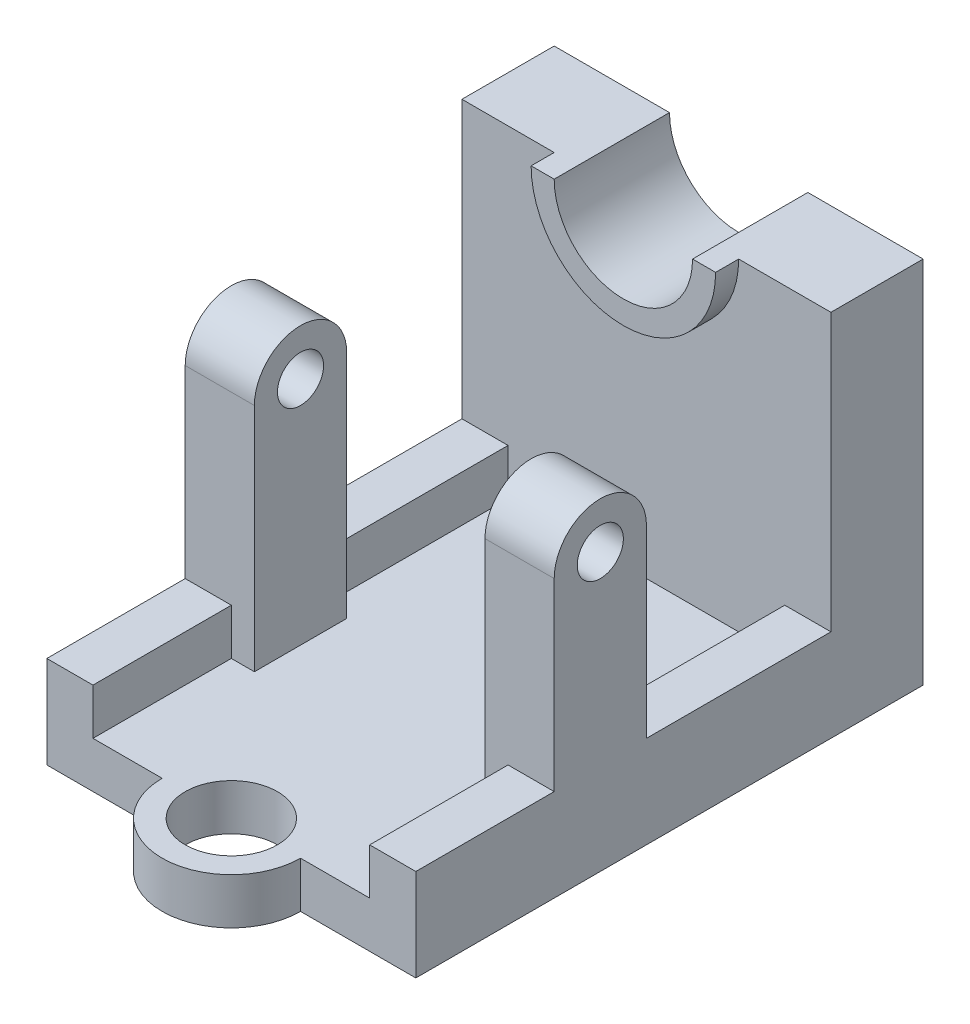
ISO-10303-21;
HEADER;
FILE_DESCRIPTION(('STEP AP214'),'2;1');
FILE_NAME('part.step','',(''),(''),'','','');
FILE_SCHEMA(('AUTOMOTIVE_DESIGN { 1 0 10303 214 1 1 1 1 }'));
ENDSEC;
DATA;
#1=APPLICATION_CONTEXT('core data for automotive mechanical design processes');
#2=APPLICATION_PROTOCOL_DEFINITION('international standard','automotive_design',2000,#1);
#3=PRODUCT_CONTEXT('',#1,'mechanical');
#4=PRODUCT('Part','Part','',(#3));
#5=PRODUCT_RELATED_PRODUCT_CATEGORY('part','',(#4));
#6=PRODUCT_DEFINITION_FORMATION('','',#4);
#7=PRODUCT_DEFINITION_CONTEXT('part definition',#1,'design');
#8=PRODUCT_DEFINITION('design','',#6,#7);
#9=PRODUCT_DEFINITION_SHAPE('','',#8);
#10=(LENGTH_UNIT() NAMED_UNIT(*) SI_UNIT(.MILLI.,.METRE.));
#11=(NAMED_UNIT(*) PLANE_ANGLE_UNIT() SI_UNIT($,.RADIAN.));
#12=(NAMED_UNIT(*) SI_UNIT($,.STERADIAN.) SOLID_ANGLE_UNIT());
#13=UNCERTAINTY_MEASURE_WITH_UNIT(LENGTH_MEASURE(1.E-05),#10,'distance_accuracy_value','');
#14=(GEOMETRIC_REPRESENTATION_CONTEXT(3) GLOBAL_UNCERTAINTY_ASSIGNED_CONTEXT((#13)) GLOBAL_UNIT_ASSIGNED_CONTEXT((#10,
#11,#12)) REPRESENTATION_CONTEXT('',''));
#15=CARTESIAN_POINT('',(0.,0.,0.));
#16=DIRECTION('',(0.,0.,1.));
#17=DIRECTION('',(1.,0.,0.));
#18=AXIS2_PLACEMENT_3D('',#15,#16,#17);
#19=CARTESIAN_POINT('',(-40.,20.,110.));
#20=DIRECTION('',(0.,-1.,0.));
#21=DIRECTION('',(0.,0.,-1.));
#22=AXIS2_PLACEMENT_3D('',#19,#20,#21);
#23=PLANE('',#22);
#24=DIRECTION('',(0.,0.,-1.));
#25=VECTOR('',#24,1.);
#26=CARTESIAN_POINT('',(-40.,20.,110.));
#27=LINE('',#26,#25);
#28=CARTESIAN_POINT('',(-40.,20.,60.));
#29=VERTEX_POINT('',#28);
#30=CARTESIAN_POINT('',(-40.,20.,20.));
#31=VERTEX_POINT('',#30);
#32=EDGE_CURVE('E500',#29,#31,#27,.T.);
#33=ORIENTED_EDGE('',*,*,#32,.F.);
#34=DIRECTION('',(1.,0.,0.));
#35=VECTOR('',#34,1.);
#36=CARTESIAN_POINT('',(-40.,20.,60.));
#37=LINE('',#36,#35);
#38=CARTESIAN_POINT('',(-30.,20.,60.));
#39=VERTEX_POINT('',#38);
#40=EDGE_CURVE('E287',#29,#39,#37,.T.);
#41=ORIENTED_EDGE('',*,*,#40,.T.);
#42=DIRECTION('',(0.,0.,-1.));
#43=VECTOR('',#42,1.);
#44=CARTESIAN_POINT('',(-30.,20.,110.));
#45=LINE('',#44,#43);
#46=CARTESIAN_POINT('',(-30.,20.,20.));
#47=VERTEX_POINT('',#46);
#48=EDGE_CURVE('E460',#39,#47,#45,.T.);
#49=ORIENTED_EDGE('',*,*,#48,.T.);
#50=DIRECTION('',(-1.,0.,0.));
#51=VECTOR('',#50,1.);
#52=CARTESIAN_POINT('',(-40.,20.,20.));
#53=LINE('',#52,#51);
#54=EDGE_CURVE('E427',#47,#31,#53,.T.);
#55=ORIENTED_EDGE('',*,*,#54,.T.);
#56=EDGE_LOOP('',(#33,#41,#49,#55));
#57=FACE_BOUND('',#56,.T.);
#58=ADVANCED_FACE('F45',(#57),#23,.F.);
#59=CARTESIAN_POINT('',(-30.,20.,110.));
#60=DIRECTION('',(-1.,0.,0.));
#61=DIRECTION('',(0.,-1.,0.));
#62=AXIS2_PLACEMENT_3D('',#59,#60,#61);
#63=PLANE('',#62);
#64=ORIENTED_EDGE('',*,*,#48,.F.);
#65=DIRECTION('',(0.,-1.,0.));
#66=VECTOR('',#65,1.);
#67=CARTESIAN_POINT('',(-30.,20.,60.));
#68=LINE('',#67,#66);
#69=CARTESIAN_POINT('',(-30.,10.,60.));
#70=VERTEX_POINT('',#69);
#71=EDGE_CURVE('E54',#39,#70,#68,.T.);
#72=ORIENTED_EDGE('',*,*,#71,.T.);
#73=DIRECTION('',(0.,0.,-1.));
#74=VECTOR('',#73,1.);
#75=CARTESIAN_POINT('',(-30.,10.,110.));
#76=LINE('',#75,#74);
#77=CARTESIAN_POINT('',(-30.,10.,20.));
#78=VERTEX_POINT('',#77);
#79=EDGE_CURVE('E475',#70,#78,#76,.T.);
#80=ORIENTED_EDGE('',*,*,#79,.T.);
#81=DIRECTION('',(0.,1.,0.));
#82=VECTOR('',#81,1.);
#83=CARTESIAN_POINT('',(-30.,20.,20.));
#84=LINE('',#83,#82);
#85=EDGE_CURVE('E503',#78,#47,#84,.T.);
#86=ORIENTED_EDGE('',*,*,#85,.T.);
#87=EDGE_LOOP('',(#64,#72,#80,#86));
#88=FACE_BOUND('',#87,.T.);
#89=ADVANCED_FACE('F530',(#88),#63,.F.);
#90=CARTESIAN_POINT('',(40.,20.,110.));
#91=DIRECTION('',(0.,-1.,0.));
#92=DIRECTION('',(0.,0.,-1.));
#93=AXIS2_PLACEMENT_3D('',#90,#91,#92);
#94=PLANE('',#93);
#95=DIRECTION('',(0.,0.,-1.));
#96=VECTOR('',#95,1.);
#97=CARTESIAN_POINT('',(30.,20.,110.));
#98=LINE('',#97,#96);
#99=CARTESIAN_POINT('',(30.,20.,60.));
#100=VERTEX_POINT('',#99);
#101=CARTESIAN_POINT('',(30.,20.,20.));
#102=VERTEX_POINT('',#101);
#103=EDGE_CURVE('E485',#100,#102,#98,.T.);
#104=ORIENTED_EDGE('',*,*,#103,.F.);
#105=DIRECTION('',(1.,0.,0.));
#106=VECTOR('',#105,1.);
#107=CARTESIAN_POINT('',(40.,20.,60.));
#108=LINE('',#107,#106);
#109=CARTESIAN_POINT('',(40.,20.,60.));
#110=VERTEX_POINT('',#109);
#111=EDGE_CURVE('E69',#100,#110,#108,.T.);
#112=ORIENTED_EDGE('',*,*,#111,.T.);
#113=DIRECTION('',(0.,0.,-1.));
#114=VECTOR('',#113,1.);
#115=CARTESIAN_POINT('',(40.,20.,110.));
#116=LINE('',#115,#114);
#117=CARTESIAN_POINT('',(40.,20.,20.));
#118=VERTEX_POINT('',#117);
#119=EDGE_CURVE('E490',#110,#118,#116,.T.);
#120=ORIENTED_EDGE('',*,*,#119,.T.);
#121=DIRECTION('',(-1.,0.,0.));
#122=VECTOR('',#121,1.);
#123=CARTESIAN_POINT('',(40.,20.,20.));
#124=LINE('',#123,#122);
#125=EDGE_CURVE('E423',#118,#102,#124,.T.);
#126=ORIENTED_EDGE('',*,*,#125,.T.);
#127=EDGE_LOOP('',(#104,#112,#120,#126));
#128=FACE_BOUND('',#127,.T.);
#129=ADVANCED_FACE('F630',(#128),#94,.F.);
#130=CARTESIAN_POINT('',(30.,20.,110.));
#131=DIRECTION('',(1.,0.,0.));
#132=DIRECTION('',(0.,1.,0.));
#133=AXIS2_PLACEMENT_3D('',#130,#131,#132);
#134=PLANE('',#133);
#135=DIRECTION('',(0.,0.,-1.));
#136=VECTOR('',#135,1.);
#137=CARTESIAN_POINT('',(30.,10.,110.));
#138=LINE('',#137,#136);
#139=CARTESIAN_POINT('',(30.,10.,60.));
#140=VERTEX_POINT('',#139);
#141=CARTESIAN_POINT('',(30.,10.,20.));
#142=VERTEX_POINT('',#141);
#143=EDGE_CURVE('E480',#140,#142,#138,.T.);
#144=ORIENTED_EDGE('',*,*,#143,.F.);
#145=DIRECTION('',(0.,1.,0.));
#146=VECTOR('',#145,1.);
#147=CARTESIAN_POINT('',(30.,20.,60.));
#148=LINE('',#147,#146);
#149=EDGE_CURVE('E334',#140,#100,#148,.T.);
#150=ORIENTED_EDGE('',*,*,#149,.T.);
#151=ORIENTED_EDGE('',*,*,#103,.T.);
#152=DIRECTION('',(0.,-1.,0.));
#153=VECTOR('',#152,1.);
#154=CARTESIAN_POINT('',(30.,20.,20.));
#155=LINE('',#154,#153);
#156=EDGE_CURVE('E419',#102,#142,#155,.T.);
#157=ORIENTED_EDGE('',*,*,#156,.T.);
#158=EDGE_LOOP('',(#144,#150,#151,#157));
#159=FACE_BOUND('',#158,.T.);
#160=ADVANCED_FACE('F629',(#159),#134,.F.);
#161=CARTESIAN_POINT('',(0.,0.,110.));
#162=DIRECTION('',(0.,0.,-1.));
#163=DIRECTION('',(-1.,0.,0.));
#164=AXIS2_PLACEMENT_3D('',#161,#162,#163);
#165=PLANE('',#164);
#166=DIRECTION('',(1.,0.,0.));
#167=VECTOR('',#166,1.);
#168=CARTESIAN_POINT('',(-40.,0.,110.));
#169=LINE('',#168,#167);
#170=CARTESIAN_POINT('',(-40.,0.,110.));
#171=VERTEX_POINT('',#170);
#172=CARTESIAN_POINT('',(-15.,0.,110.));
#173=VERTEX_POINT('',#172);
#174=EDGE_CURVE('E441',#171,#173,#169,.T.);
#175=ORIENTED_EDGE('',*,*,#174,.T.);
#176=DIRECTION('',(0.,1.,0.));
#177=VECTOR('',#176,1.);
#178=CARTESIAN_POINT('',(-15.,-33.5410196624969,110.));
#179=LINE('',#178,#177);
#180=CARTESIAN_POINT('',(-15.,10.,110.));
#181=VERTEX_POINT('',#180);
#182=EDGE_CURVE('E353',#173,#181,#179,.T.);
#183=ORIENTED_EDGE('',*,*,#182,.T.);
#184=DIRECTION('',(-1.,0.,0.));
#185=VECTOR('',#184,1.);
#186=CARTESIAN_POINT('',(-30.,10.,110.));
#187=LINE('',#186,#185);
#188=CARTESIAN_POINT('',(-30.,10.,110.));
#189=VERTEX_POINT('',#188);
#190=EDGE_CURVE('E453',#181,#189,#187,.T.);
#191=ORIENTED_EDGE('',*,*,#190,.T.);
#192=DIRECTION('',(0.,1.,0.));
#193=VECTOR('',#192,1.);
#194=CARTESIAN_POINT('',(-30.,20.,110.));
#195=LINE('',#194,#193);
#196=CARTESIAN_POINT('',(-30.,20.,110.));
#197=VERTEX_POINT('',#196);
#198=EDGE_CURVE('E457',#189,#197,#195,.T.);
#199=ORIENTED_EDGE('',*,*,#198,.T.);
#200=DIRECTION('',(-1.,0.,0.));
#201=VECTOR('',#200,1.);
#202=CARTESIAN_POINT('',(-40.,20.,110.));
#203=LINE('',#202,#201);
#204=CARTESIAN_POINT('',(-40.,20.,110.));
#205=VERTEX_POINT('',#204);
#206=EDGE_CURVE('E432',#197,#205,#203,.T.);
#207=ORIENTED_EDGE('',*,*,#206,.T.);
#208=DIRECTION('',(0.,-1.,0.));
#209=VECTOR('',#208,1.);
#210=CARTESIAN_POINT('',(-40.,20.,110.));
#211=LINE('',#210,#209);
#212=EDGE_CURVE('E436',#205,#171,#211,.T.);
#213=ORIENTED_EDGE('',*,*,#212,.T.);
#214=EDGE_LOOP('',(#175,#183,#191,#199,#207,#213));
#215=FACE_BOUND('',#214,.T.);
#216=ADVANCED_FACE('F637',(#215),#165,.F.);
#217=CARTESIAN_POINT('',(0.,0.,20.));
#218=DIRECTION('',(0.,0.,1.));
#219=DIRECTION('',(1.,0.,0.));
#220=AXIS2_PLACEMENT_3D('',#217,#218,#219);
#221=PLANE('',#220);
#222=DIRECTION('',(1.,0.,0.));
#223=VECTOR('',#222,1.);
#224=CARTESIAN_POINT('',(40.,80.,20.));
#225=LINE('',#224,#223);
#226=CARTESIAN_POINT('',(20.,80.,20.));
#227=VERTEX_POINT('',#226);
#228=CARTESIAN_POINT('',(40.,80.,20.));
#229=VERTEX_POINT('',#228);
#230=EDGE_CURVE('E399',#227,#229,#225,.T.);
#231=ORIENTED_EDGE('',*,*,#230,.F.);
#232=CARTESIAN_POINT('',(0.,80.,20.));
#233=DIRECTION('',(0.,0.,1.));
#234=DIRECTION('',(1.,0.,0.));
#235=AXIS2_PLACEMENT_3D('',#232,#233,#234);
#236=CIRCLE('',#235,20.);
#237=CARTESIAN_POINT('',(-20.,80.,20.));
#238=VERTEX_POINT('',#237);
#239=EDGE_CURVE('E352',#238,#227,#236,.T.);
#240=ORIENTED_EDGE('',*,*,#239,.F.);
#241=CARTESIAN_POINT('',(-40.,80.,20.));
#242=VERTEX_POINT('',#241);
#243=EDGE_CURVE('E400',#242,#238,#225,.T.);
#244=ORIENTED_EDGE('',*,*,#243,.F.);
#245=DIRECTION('',(0.,1.,0.));
#246=VECTOR('',#245,1.);
#247=CARTESIAN_POINT('',(-40.,0.,20.));
#248=LINE('',#247,#246);
#249=EDGE_CURVE('E395',#31,#242,#248,.T.);
#250=ORIENTED_EDGE('',*,*,#249,.F.);
#251=ORIENTED_EDGE('',*,*,#54,.F.);
#252=ORIENTED_EDGE('',*,*,#85,.F.);
#253=DIRECTION('',(-1.,0.,0.));
#254=VECTOR('',#253,1.);
#255=CARTESIAN_POINT('',(-30.,10.,20.));
#256=LINE('',#255,#254);
#257=EDGE_CURVE('E412',#142,#78,#256,.T.);
#258=ORIENTED_EDGE('',*,*,#257,.F.);
#259=ORIENTED_EDGE('',*,*,#156,.F.);
#260=ORIENTED_EDGE('',*,*,#125,.F.);
#261=DIRECTION('',(0.,-1.,0.));
#262=VECTOR('',#261,1.);
#263=CARTESIAN_POINT('',(40.,0.,20.));
#264=LINE('',#263,#262);
#265=EDGE_CURVE('E391',#229,#118,#264,.T.);
#266=ORIENTED_EDGE('',*,*,#265,.F.);
#267=EDGE_LOOP('',(#231,#240,#244,#250,#251,#252,#258,#259,#260,#266));
#268=FACE_BOUND('',#267,.T.);
#269=ADVANCED_FACE('F563',(#268),#221,.T.);
#270=CARTESIAN_POINT('',(40.,80.,20.));
#271=DIRECTION('',(0.,1.,0.));
#272=DIRECTION('',(0.,0.,1.));
#273=AXIS2_PLACEMENT_3D('',#270,#271,#272);
#274=PLANE('',#273);
#275=DIRECTION('',(0.,0.,1.));
#276=VECTOR('',#275,1.);
#277=CARTESIAN_POINT('',(-15.,80.,0.));
#278=LINE('',#277,#276);
#279=CARTESIAN_POINT('',(-15.,80.,0.));
#280=VERTEX_POINT('',#279);
#281=CARTESIAN_POINT('',(-15.,80.,25.));
#282=VERTEX_POINT('',#281);
#283=EDGE_CURVE('E510',#280,#282,#278,.T.);
#284=ORIENTED_EDGE('',*,*,#283,.F.);
#285=DIRECTION('',(1.,0.,0.));
#286=VECTOR('',#285,1.);
#287=CARTESIAN_POINT('',(40.,80.,0.));
#288=LINE('',#287,#286);
#289=CARTESIAN_POINT('',(-40.,80.,0.));
#290=VERTEX_POINT('',#289);
#291=EDGE_CURVE('E396',#290,#280,#288,.T.);
#292=ORIENTED_EDGE('',*,*,#291,.F.);
#293=DIRECTION('',(0.,0.,-1.));
#294=VECTOR('',#293,1.);
#295=CARTESIAN_POINT('',(-40.,80.,20.));
#296=LINE('',#295,#294);
#297=EDGE_CURVE('E404',#242,#290,#296,.T.);
#298=ORIENTED_EDGE('',*,*,#297,.F.);
#299=ORIENTED_EDGE('',*,*,#243,.T.);
#300=DIRECTION('',(0.,0.,-1.));
#301=VECTOR('',#300,1.);
#302=CARTESIAN_POINT('',(-20.,80.,25.));
#303=LINE('',#302,#301);
#304=CARTESIAN_POINT('',(-20.,80.,25.));
#305=VERTEX_POINT('',#304);
#306=EDGE_CURVE('E383',#305,#238,#303,.T.);
#307=ORIENTED_EDGE('',*,*,#306,.F.);
#308=DIRECTION('',(-1.,0.,0.));
#309=VECTOR('',#308,1.);
#310=CARTESIAN_POINT('',(-20.,80.,25.));
#311=LINE('',#310,#309);
#312=EDGE_CURVE('E367',#282,#305,#311,.T.);
#313=ORIENTED_EDGE('',*,*,#312,.F.);
#314=EDGE_LOOP('',(#284,#292,#298,#299,#307,#313));
#315=FACE_BOUND('',#314,.T.);
#316=ADVANCED_FACE('F610',(#315),#274,.T.);
#317=CARTESIAN_POINT('',(-30.,20.,80.));
#318=VERTEX_POINT('',#317);
#319=EDGE_CURVE('E471',#197,#318,#45,.T.);
#320=ORIENTED_EDGE('',*,*,#319,.T.);
#321=DIRECTION('',(-1.,0.,0.));
#322=VECTOR('',#321,1.);
#323=CARTESIAN_POINT('',(-40.,20.,80.));
#324=LINE('',#323,#322);
#325=CARTESIAN_POINT('',(-40.,20.,80.));
#326=VERTEX_POINT('',#325);
#327=EDGE_CURVE('E61',#318,#326,#324,.T.);
#328=ORIENTED_EDGE('',*,*,#327,.T.);
#329=EDGE_CURVE('E252',#205,#326,#27,.T.);
#330=ORIENTED_EDGE('',*,*,#329,.F.);
#331=ORIENTED_EDGE('',*,*,#206,.F.);
#332=EDGE_LOOP('',(#320,#328,#330,#331));
#333=FACE_BOUND('',#332,.T.);
#334=ADVANCED_FACE('F47',(#333),#23,.F.);
#335=CARTESIAN_POINT('',(-40.,20.,110.));
#336=DIRECTION('',(1.,0.,0.));
#337=DIRECTION('',(0.,0.,-1.));
#338=AXIS2_PLACEMENT_3D('',#335,#336,#337);
#339=PLANE('',#338);
#340=ORIENTED_EDGE('',*,*,#329,.T.);
#341=DIRECTION('',(0.,-1.,0.));
#342=VECTOR('',#341,1.);
#343=CARTESIAN_POINT('',(-40.,60.,80.));
#344=LINE('',#343,#342);
#345=CARTESIAN_POINT('',(-40.,60.,80.));
#346=VERTEX_POINT('',#345);
#347=EDGE_CURVE('E233',#346,#326,#344,.T.);
#348=ORIENTED_EDGE('',*,*,#347,.F.);
#349=CARTESIAN_POINT('',(-40.,60.,70.));
#350=DIRECTION('',(1.,0.,0.));
#351=DIRECTION('',(0.,0.,-1.));
#352=AXIS2_PLACEMENT_3D('',#349,#350,#351);
#353=CIRCLE('',#352,9.99999999999999);
#354=CARTESIAN_POINT('',(-40.,60.,60.));
#355=VERTEX_POINT('',#354);
#356=EDGE_CURVE('E250',#355,#346,#353,.T.);
#357=ORIENTED_EDGE('',*,*,#356,.F.);
#358=DIRECTION('',(0.,1.,0.));
#359=VECTOR('',#358,1.);
#360=CARTESIAN_POINT('',(-40.,0.,60.));
#361=LINE('',#360,#359);
#362=EDGE_CURVE('E242',#29,#355,#361,.T.);
#363=ORIENTED_EDGE('',*,*,#362,.F.);
#364=ORIENTED_EDGE('',*,*,#32,.T.);
#365=ORIENTED_EDGE('',*,*,#249,.T.);
#366=ORIENTED_EDGE('',*,*,#297,.T.);
#367=DIRECTION('',(0.,-1.,0.));
#368=VECTOR('',#367,1.);
#369=CARTESIAN_POINT('',(-40.,20.,0.));
#370=LINE('',#369,#368);
#371=CARTESIAN_POINT('',(-40.,0.,0.));
#372=VERTEX_POINT('',#371);
#373=EDGE_CURVE('E431',#290,#372,#370,.T.);
#374=ORIENTED_EDGE('',*,*,#373,.T.);
#375=DIRECTION('',(0.,0.,-1.));
#376=VECTOR('',#375,1.);
#377=CARTESIAN_POINT('',(-40.,0.,110.));
#378=LINE('',#377,#376);
#379=EDGE_CURVE('E497',#171,#372,#378,.T.);
#380=ORIENTED_EDGE('',*,*,#379,.F.);
#381=ORIENTED_EDGE('',*,*,#212,.F.);
#382=EDGE_LOOP('',(#340,#348,#357,#363,#364,#365,#366,#374,#380,#381));
#383=FACE_BOUND('',#382,.T.);
#384=CARTESIAN_POINT('',(-40.,60.,70.));
#385=DIRECTION('',(1.,0.,0.));
#386=DIRECTION('',(0.,0.,-1.));
#387=AXIS2_PLACEMENT_3D('',#384,#385,#386);
#388=CIRCLE('',#387,5.00000000000001);
#389=CARTESIAN_POINT('',(-40.,60.,65.));
#390=VERTEX_POINT('',#389);
#391=EDGE_CURVE('E272',#390,#390,#388,.T.);
#392=ORIENTED_EDGE('',*,*,#391,.T.);
#393=EDGE_LOOP('',(#392));
#394=FACE_BOUND('',#393,.T.);
#395=ADVANCED_FACE('F247',(#383,#394),#339,.F.);
#396=CARTESIAN_POINT('',(-40.,0.,110.));
#397=DIRECTION('',(0.,1.,0.));
#398=DIRECTION('',(0.,0.,1.));
#399=AXIS2_PLACEMENT_3D('',#396,#397,#398);
#400=PLANE('',#399);
#401=ORIENTED_EDGE('',*,*,#379,.T.);
#402=DIRECTION('',(1.,0.,0.));
#403=VECTOR('',#402,1.);
#404=CARTESIAN_POINT('',(-40.,0.,0.));
#405=LINE('',#404,#403);
#406=CARTESIAN_POINT('',(40.,0.,0.));
#407=VERTEX_POINT('',#406);
#408=EDGE_CURVE('E464',#372,#407,#405,.T.);
#409=ORIENTED_EDGE('',*,*,#408,.T.);
#410=DIRECTION('',(0.,0.,-1.));
#411=VECTOR('',#410,1.);
#412=CARTESIAN_POINT('',(40.,0.,110.));
#413=LINE('',#412,#411);
#414=CARTESIAN_POINT('',(40.,0.,110.));
#415=VERTEX_POINT('',#414);
#416=EDGE_CURVE('E494',#415,#407,#413,.T.);
#417=ORIENTED_EDGE('',*,*,#416,.F.);
#418=CARTESIAN_POINT('',(15.,0.,110.));
#419=VERTEX_POINT('',#418);
#420=EDGE_CURVE('E440',#419,#415,#169,.T.);
#421=ORIENTED_EDGE('',*,*,#420,.F.);
#422=CARTESIAN_POINT('',(0.,0.,110.));
#423=DIRECTION('',(0.,1.,0.));
#424=DIRECTION('',(0.,0.,1.));
#425=AXIS2_PLACEMENT_3D('',#422,#423,#424);
#426=CIRCLE('',#425,15.);
#427=EDGE_CURVE('E348',#419,#173,#426,.F.);
#428=ORIENTED_EDGE('',*,*,#427,.T.);
#429=ORIENTED_EDGE('',*,*,#174,.F.);
#430=EDGE_LOOP('',(#401,#409,#417,#421,#428,#429));
#431=FACE_BOUND('',#430,.T.);
#432=CARTESIAN_POINT('',(0.,0.,110.));
#433=DIRECTION('',(0.,1.,0.));
#434=DIRECTION('',(0.,0.,1.));
#435=AXIS2_PLACEMENT_3D('',#432,#433,#434);
#436=CIRCLE('',#435,10.);
#437=CARTESIAN_POINT('',(0.,0.,120.));
#438=VERTEX_POINT('',#437);
#439=EDGE_CURVE('E343',#438,#438,#436,.T.);
#440=ORIENTED_EDGE('',*,*,#439,.T.);
#441=EDGE_LOOP('',(#440));
#442=FACE_BOUND('',#441,.T.);
#443=ADVANCED_FACE('F601',(#431,#442),#400,.F.);
#444=CARTESIAN_POINT('',(40.,20.,110.));
#445=DIRECTION('',(-1.,0.,0.));
#446=DIRECTION('',(0.,0.,1.));
#447=AXIS2_PLACEMENT_3D('',#444,#445,#446);
#448=PLANE('',#447);
#449=ORIENTED_EDGE('',*,*,#416,.T.);
#450=DIRECTION('',(0.,1.,0.));
#451=VECTOR('',#450,1.);
#452=CARTESIAN_POINT('',(40.,20.,0.));
#453=LINE('',#452,#451);
#454=CARTESIAN_POINT('',(40.,80.,0.));
#455=VERTEX_POINT('',#454);
#456=EDGE_CURVE('E437',#407,#455,#453,.T.);
#457=ORIENTED_EDGE('',*,*,#456,.T.);
#458=DIRECTION('',(0.,0.,-1.));
#459=VECTOR('',#458,1.);
#460=CARTESIAN_POINT('',(40.,80.,20.));
#461=LINE('',#460,#459);
#462=EDGE_CURVE('E408',#229,#455,#461,.T.);
#463=ORIENTED_EDGE('',*,*,#462,.F.);
#464=ORIENTED_EDGE('',*,*,#265,.T.);
#465=ORIENTED_EDGE('',*,*,#119,.F.);
#466=DIRECTION('',(0.,1.,0.));
#467=VECTOR('',#466,1.);
#468=CARTESIAN_POINT('',(40.,0.,60.));
#469=LINE('',#468,#467);
#470=CARTESIAN_POINT('',(40.,60.,60.));
#471=VERTEX_POINT('',#470);
#472=EDGE_CURVE('E305',#110,#471,#469,.T.);
#473=ORIENTED_EDGE('',*,*,#472,.T.);
#474=CARTESIAN_POINT('',(40.,60.,70.));
#475=DIRECTION('',(1.,0.,0.));
#476=DIRECTION('',(0.,0.,-1.));
#477=AXIS2_PLACEMENT_3D('',#474,#475,#476);
#478=CIRCLE('',#477,9.99999999999999);
#479=CARTESIAN_POINT('',(40.,60.,80.));
#480=VERTEX_POINT('',#479);
#481=EDGE_CURVE('E296',#471,#480,#478,.T.);
#482=ORIENTED_EDGE('',*,*,#481,.T.);
#483=DIRECTION('',(0.,-1.,0.));
#484=VECTOR('',#483,1.);
#485=CARTESIAN_POINT('',(40.,60.,80.));
#486=LINE('',#485,#484);
#487=CARTESIAN_POINT('',(40.,20.,80.));
#488=VERTEX_POINT('',#487);
#489=EDGE_CURVE('E316',#480,#488,#486,.T.);
#490=ORIENTED_EDGE('',*,*,#489,.T.);
#491=CARTESIAN_POINT('',(40.,20.,110.));
#492=VERTEX_POINT('',#491);
#493=EDGE_CURVE('E491',#492,#488,#116,.T.);
#494=ORIENTED_EDGE('',*,*,#493,.F.);
#495=DIRECTION('',(0.,1.,0.));
#496=VECTOR('',#495,1.);
#497=CARTESIAN_POINT('',(40.,20.,110.));
#498=LINE('',#497,#496);
#499=EDGE_CURVE('E444',#415,#492,#498,.T.);
#500=ORIENTED_EDGE('',*,*,#499,.F.);
#501=EDGE_LOOP('',(#449,#457,#463,#464,#465,#473,#482,#490,#494,#500));
#502=FACE_BOUND('',#501,.T.);
#503=CARTESIAN_POINT('',(40.,60.,70.));
#504=DIRECTION('',(1.,0.,0.));
#505=DIRECTION('',(0.,0.,-1.));
#506=AXIS2_PLACEMENT_3D('',#503,#504,#505);
#507=CIRCLE('',#506,5.00000000000001);
#508=CARTESIAN_POINT('',(40.,60.,65.));
#509=VERTEX_POINT('',#508);
#510=EDGE_CURVE('E291',#509,#509,#507,.T.);
#511=ORIENTED_EDGE('',*,*,#510,.F.);
#512=EDGE_LOOP('',(#511));
#513=FACE_BOUND('',#512,.T.);
#514=ADVANCED_FACE('F552',(#502,#513),#448,.F.);
#515=ORIENTED_EDGE('',*,*,#493,.T.);
#516=DIRECTION('',(-1.,0.,0.));
#517=VECTOR('',#516,1.);
#518=CARTESIAN_POINT('',(40.,20.,80.));
#519=LINE('',#518,#517);
#520=CARTESIAN_POINT('',(30.,20.,80.));
#521=VERTEX_POINT('',#520);
#522=EDGE_CURVE('E331',#488,#521,#519,.T.);
#523=ORIENTED_EDGE('',*,*,#522,.T.);
#524=CARTESIAN_POINT('',(30.,20.,110.));
#525=VERTEX_POINT('',#524);
#526=EDGE_CURVE('E486',#525,#521,#98,.T.);
#527=ORIENTED_EDGE('',*,*,#526,.F.);
#528=DIRECTION('',(-1.,0.,0.));
#529=VECTOR('',#528,1.);
#530=CARTESIAN_POINT('',(40.,20.,110.));
#531=LINE('',#530,#529);
#532=EDGE_CURVE('E447',#492,#525,#531,.T.);
#533=ORIENTED_EDGE('',*,*,#532,.F.);
#534=EDGE_LOOP('',(#515,#523,#527,#533));
#535=FACE_BOUND('',#534,.T.);
#536=ADVANCED_FACE('F590',(#535),#94,.F.);
#537=ORIENTED_EDGE('',*,*,#526,.T.);
#538=DIRECTION('',(0.,-1.,0.));
#539=VECTOR('',#538,1.);
#540=CARTESIAN_POINT('',(30.,20.,80.));
#541=LINE('',#540,#539);
#542=CARTESIAN_POINT('',(30.,10.,80.));
#543=VERTEX_POINT('',#542);
#544=EDGE_CURVE('E326',#521,#543,#541,.T.);
#545=ORIENTED_EDGE('',*,*,#544,.T.);
#546=CARTESIAN_POINT('',(30.,10.,110.));
#547=VERTEX_POINT('',#546);
#548=EDGE_CURVE('E481',#547,#543,#138,.T.);
#549=ORIENTED_EDGE('',*,*,#548,.F.);
#550=DIRECTION('',(0.,-1.,0.));
#551=VECTOR('',#550,1.);
#552=CARTESIAN_POINT('',(30.,20.,110.));
#553=LINE('',#552,#551);
#554=EDGE_CURVE('E450',#525,#547,#553,.T.);
#555=ORIENTED_EDGE('',*,*,#554,.F.);
#556=EDGE_LOOP('',(#537,#545,#549,#555));
#557=FACE_BOUND('',#556,.T.);
#558=ADVANCED_FACE('F593',(#557),#134,.F.);
#559=CARTESIAN_POINT('',(-30.,10.,110.));
#560=DIRECTION('',(0.,-1.,0.));
#561=DIRECTION('',(0.,0.,-1.));
#562=AXIS2_PLACEMENT_3D('',#559,#560,#561);
#563=PLANE('',#562);
#564=ORIENTED_EDGE('',*,*,#79,.F.);
#565=DIRECTION('',(1.,0.,0.));
#566=VECTOR('',#565,1.);
#567=CARTESIAN_POINT('',(-30.,10.,60.));
#568=LINE('',#567,#566);
#569=CARTESIAN_POINT('',(-25.,10.,60.));
#570=VERTEX_POINT('',#569);
#571=EDGE_CURVE('E283',#70,#570,#568,.T.);
#572=ORIENTED_EDGE('',*,*,#571,.T.);
#573=DIRECTION('',(0.,0.,1.));
#574=VECTOR('',#573,1.);
#575=CARTESIAN_POINT('',(-25.,10.,110.));
#576=LINE('',#575,#574);
#577=CARTESIAN_POINT('',(-25.,10.,80.));
#578=VERTEX_POINT('',#577);
#579=EDGE_CURVE('E11',#570,#578,#576,.T.);
#580=ORIENTED_EDGE('',*,*,#579,.T.);
#581=DIRECTION('',(-1.,0.,0.));
#582=VECTOR('',#581,1.);
#583=CARTESIAN_POINT('',(-30.,10.,80.));
#584=LINE('',#583,#582);
#585=CARTESIAN_POINT('',(-30.,10.,80.));
#586=VERTEX_POINT('',#585);
#587=EDGE_CURVE('E276',#578,#586,#584,.T.);
#588=ORIENTED_EDGE('',*,*,#587,.T.);
#589=EDGE_CURVE('E476',#189,#586,#76,.T.);
#590=ORIENTED_EDGE('',*,*,#589,.F.);
#591=ORIENTED_EDGE('',*,*,#190,.F.);
#592=CARTESIAN_POINT('',(0.,10.,110.));
#593=DIRECTION('',(0.,1.,0.));
#594=DIRECTION('',(0.,0.,1.));
#595=AXIS2_PLACEMENT_3D('',#592,#593,#594);
#596=CIRCLE('',#595,15.);
#597=CARTESIAN_POINT('',(15.,10.,110.));
#598=VERTEX_POINT('',#597);
#599=EDGE_CURVE('E347',#181,#598,#596,.T.);
#600=ORIENTED_EDGE('',*,*,#599,.T.);
#601=EDGE_CURVE('E454',#547,#598,#187,.T.);
#602=ORIENTED_EDGE('',*,*,#601,.F.);
#603=ORIENTED_EDGE('',*,*,#548,.T.);
#604=DIRECTION('',(-1.,0.,0.));
#605=VECTOR('',#604,1.);
#606=CARTESIAN_POINT('',(-30.,10.,80.));
#607=LINE('',#606,#605);
#608=CARTESIAN_POINT('',(25.,10.,80.));
#609=VERTEX_POINT('',#608);
#610=EDGE_CURVE('E517',#543,#609,#607,.T.);
#611=ORIENTED_EDGE('',*,*,#610,.T.);
#612=DIRECTION('',(0.,0.,1.));
#613=VECTOR('',#612,1.);
#614=CARTESIAN_POINT('',(25.,10.,110.));
#615=LINE('',#614,#613);
#616=CARTESIAN_POINT('',(25.,10.,60.));
#617=VERTEX_POINT('',#616);
#618=EDGE_CURVE('E513',#617,#609,#615,.T.);
#619=ORIENTED_EDGE('',*,*,#618,.F.);
#620=DIRECTION('',(1.,0.,0.));
#621=VECTOR('',#620,1.);
#622=CARTESIAN_POINT('',(-30.,10.,60.));
#623=LINE('',#622,#621);
#624=EDGE_CURVE('E520',#617,#140,#623,.T.);
#625=ORIENTED_EDGE('',*,*,#624,.T.);
#626=ORIENTED_EDGE('',*,*,#143,.T.);
#627=ORIENTED_EDGE('',*,*,#257,.T.);
#628=EDGE_LOOP('',(#564,#572,#580,#588,#590,#591,#600,#602,#603,#611,#619,#625,#626,#627));
#629=FACE_BOUND('',#628,.T.);
#630=CARTESIAN_POINT('',(0.,10.,110.));
#631=DIRECTION('',(0.,1.,0.));
#632=DIRECTION('',(0.,0.,1.));
#633=AXIS2_PLACEMENT_3D('',#630,#631,#632);
#634=CIRCLE('',#633,10.);
#635=CARTESIAN_POINT('',(0.,10.,120.));
#636=VERTEX_POINT('',#635);
#637=EDGE_CURVE('E339',#636,#636,#634,.T.);
#638=ORIENTED_EDGE('',*,*,#637,.F.);
#639=EDGE_LOOP('',(#638));
#640=FACE_BOUND('',#639,.T.);
#641=ADVANCED_FACE('F533',(#629,#640),#563,.F.);
#642=ORIENTED_EDGE('',*,*,#589,.T.);
#643=DIRECTION('',(0.,1.,0.));
#644=VECTOR('',#643,1.);
#645=CARTESIAN_POINT('',(-30.,20.,80.));
#646=LINE('',#645,#644);
#647=EDGE_CURVE('E523',#586,#318,#646,.T.);
#648=ORIENTED_EDGE('',*,*,#647,.T.);
#649=ORIENTED_EDGE('',*,*,#319,.F.);
#650=ORIENTED_EDGE('',*,*,#198,.F.);
#651=EDGE_LOOP('',(#642,#648,#649,#650));
#652=FACE_BOUND('',#651,.T.);
#653=ADVANCED_FACE('F641',(#652),#63,.F.);
#654=ORIENTED_EDGE('',*,*,#601,.T.);
#655=DIRECTION('',(0.,1.,0.));
#656=VECTOR('',#655,1.);
#657=CARTESIAN_POINT('',(15.,-33.5410196624969,110.));
#658=LINE('',#657,#656);
#659=EDGE_CURVE('E357',#419,#598,#658,.T.);
#660=ORIENTED_EDGE('',*,*,#659,.F.);
#661=ORIENTED_EDGE('',*,*,#420,.T.);
#662=ORIENTED_EDGE('',*,*,#499,.T.);
#663=ORIENTED_EDGE('',*,*,#532,.T.);
#664=ORIENTED_EDGE('',*,*,#554,.T.);
#665=EDGE_LOOP('',(#654,#660,#661,#662,#663,#664));
#666=FACE_BOUND('',#665,.T.);
#667=ADVANCED_FACE('F597',(#666),#165,.F.);
#668=CARTESIAN_POINT('',(0.,0.,0.));
#669=DIRECTION('',(0.,0.,-1.));
#670=DIRECTION('',(-1.,0.,0.));
#671=AXIS2_PLACEMENT_3D('',#668,#669,#670);
#672=PLANE('',#671);
#673=CARTESIAN_POINT('',(0.,80.,0.));
#674=DIRECTION('',(0.,0.,1.));
#675=DIRECTION('',(1.,0.,0.));
#676=AXIS2_PLACEMENT_3D('',#673,#674,#675);
#677=CIRCLE('',#676,15.);
#678=CARTESIAN_POINT('',(15.,80.,0.));
#679=VERTEX_POINT('',#678);
#680=EDGE_CURVE('E386',#280,#679,#677,.T.);
#681=ORIENTED_EDGE('',*,*,#680,.T.);
#682=EDGE_CURVE('E390',#679,#455,#288,.T.);
#683=ORIENTED_EDGE('',*,*,#682,.T.);
#684=ORIENTED_EDGE('',*,*,#456,.F.);
#685=ORIENTED_EDGE('',*,*,#408,.F.);
#686=ORIENTED_EDGE('',*,*,#373,.F.);
#687=ORIENTED_EDGE('',*,*,#291,.T.);
#688=EDGE_LOOP('',(#681,#683,#684,#685,#686,#687));
#689=FACE_BOUND('',#688,.T.);
#690=ADVANCED_FACE('F547',(#689),#672,.T.);
#691=DIRECTION('',(0.,0.,1.));
#692=VECTOR('',#691,1.);
#693=CARTESIAN_POINT('',(15.,80.,0.));
#694=LINE('',#693,#692);
#695=CARTESIAN_POINT('',(15.,80.,25.));
#696=VERTEX_POINT('',#695);
#697=EDGE_CURVE('E507',#696,#679,#694,.F.);
#698=ORIENTED_EDGE('',*,*,#697,.F.);
#699=DIRECTION('',(-1.,0.,0.));
#700=VECTOR('',#699,1.);
#701=CARTESIAN_POINT('',(15.,80.,25.));
#702=LINE('',#701,#700);
#703=CARTESIAN_POINT('',(20.,80.,25.));
#704=VERTEX_POINT('',#703);
#705=EDGE_CURVE('E373',#704,#696,#702,.T.);
#706=ORIENTED_EDGE('',*,*,#705,.F.);
#707=DIRECTION('',(0.,0.,-1.));
#708=VECTOR('',#707,1.);
#709=CARTESIAN_POINT('',(20.,80.,25.));
#710=LINE('',#709,#708);
#711=EDGE_CURVE('E377',#704,#227,#710,.T.);
#712=ORIENTED_EDGE('',*,*,#711,.T.);
#713=ORIENTED_EDGE('',*,*,#230,.T.);
#714=ORIENTED_EDGE('',*,*,#462,.T.);
#715=ORIENTED_EDGE('',*,*,#682,.F.);
#716=EDGE_LOOP('',(#698,#706,#712,#713,#714,#715));
#717=FACE_BOUND('',#716,.T.);
#718=ADVANCED_FACE('F557',(#717),#274,.T.);
#719=CARTESIAN_POINT('',(0.,80.,0.));
#720=DIRECTION('',(0.,0.,1.));
#721=DIRECTION('',(1.,0.,0.));
#722=AXIS2_PLACEMENT_3D('',#719,#720,#721);
#723=CYLINDRICAL_SURFACE('',#722,15.);
#724=ORIENTED_EDGE('',*,*,#283,.T.);
#725=CARTESIAN_POINT('',(0.,80.,25.));
#726=DIRECTION('',(0.,0.,-1.));
#727=DIRECTION('',(1.,0.,0.));
#728=AXIS2_PLACEMENT_3D('',#725,#726,#727);
#729=CIRCLE('',#728,15.);
#730=EDGE_CURVE('E363',#696,#282,#729,.T.);
#731=ORIENTED_EDGE('',*,*,#730,.F.);
#732=ORIENTED_EDGE('',*,*,#697,.T.);
#733=ORIENTED_EDGE('',*,*,#680,.F.);
#734=EDGE_LOOP('',(#724,#731,#732,#733));
#735=FACE_BOUND('',#734,.T.);
#736=ADVANCED_FACE('F615',(#735),#723,.F.);
#737=CARTESIAN_POINT('',(0.,80.,25.));
#738=DIRECTION('',(0.,0.,-1.));
#739=DIRECTION('',(-1.,0.,0.));
#740=AXIS2_PLACEMENT_3D('',#737,#738,#739);
#741=CYLINDRICAL_SURFACE('',#740,20.);
#742=ORIENTED_EDGE('',*,*,#239,.T.);
#743=ORIENTED_EDGE('',*,*,#711,.F.);
#744=CARTESIAN_POINT('',(0.,80.,25.));
#745=DIRECTION('',(0.,0.,1.));
#746=DIRECTION('',(1.,0.,0.));
#747=AXIS2_PLACEMENT_3D('',#744,#745,#746);
#748=CIRCLE('',#747,20.);
#749=EDGE_CURVE('E370',#305,#704,#748,.T.);
#750=ORIENTED_EDGE('',*,*,#749,.F.);
#751=ORIENTED_EDGE('',*,*,#306,.T.);
#752=EDGE_LOOP('',(#742,#743,#750,#751));
#753=FACE_BOUND('',#752,.T.);
#754=ADVANCED_FACE('F620',(#753),#741,.T.);
#755=CARTESIAN_POINT('',(0.,80.,25.));
#756=DIRECTION('',(0.,0.,1.));
#757=DIRECTION('',(1.,0.,0.));
#758=AXIS2_PLACEMENT_3D('',#755,#756,#757);
#759=PLANE('',#758);
#760=ORIENTED_EDGE('',*,*,#730,.T.);
#761=ORIENTED_EDGE('',*,*,#312,.T.);
#762=ORIENTED_EDGE('',*,*,#749,.T.);
#763=ORIENTED_EDGE('',*,*,#705,.T.);
#764=EDGE_LOOP('',(#760,#761,#762,#763));
#765=FACE_BOUND('',#764,.T.);
#766=ADVANCED_FACE('F617',(#765),#759,.T.);
#767=CARTESIAN_POINT('',(0.,-33.5410196624969,110.));
#768=DIRECTION('',(0.,1.,0.));
#769=DIRECTION('',(0.,0.,1.));
#770=AXIS2_PLACEMENT_3D('',#767,#768,#769);
#771=CYLINDRICAL_SURFACE('',#770,15.);
#772=ORIENTED_EDGE('',*,*,#427,.F.);
#773=ORIENTED_EDGE('',*,*,#659,.T.);
#774=ORIENTED_EDGE('',*,*,#599,.F.);
#775=ORIENTED_EDGE('',*,*,#182,.F.);
#776=EDGE_LOOP('',(#772,#773,#774,#775));
#777=FACE_BOUND('',#776,.T.);
#778=ADVANCED_FACE('F695',(#777),#771,.T.);
#779=CARTESIAN_POINT('',(0.,10.,110.));
#780=DIRECTION('',(0.,1.,0.));
#781=DIRECTION('',(0.,0.,1.));
#782=AXIS2_PLACEMENT_3D('',#779,#780,#781);
#783=CYLINDRICAL_SURFACE('',#782,10.);
#784=ORIENTED_EDGE('',*,*,#439,.F.);
#785=EDGE_LOOP('',(#784));
#786=FACE_BOUND('',#785,.T.);
#787=ORIENTED_EDGE('',*,*,#637,.T.);
#788=EDGE_LOOP('',(#787));
#789=FACE_BOUND('',#788,.T.);
#790=ADVANCED_FACE('F689',(#786,#789),#783,.F.);
#791=CARTESIAN_POINT('',(25.,0.,60.));
#792=DIRECTION('',(0.,0.,-1.));
#793=DIRECTION('',(0.,1.,0.));
#794=AXIS2_PLACEMENT_3D('',#791,#792,#793);
#795=PLANE('',#794);
#796=ORIENTED_EDGE('',*,*,#111,.F.);
#797=ORIENTED_EDGE('',*,*,#149,.F.);
#798=ORIENTED_EDGE('',*,*,#624,.F.);
#799=DIRECTION('',(0.,1.,0.));
#800=VECTOR('',#799,1.);
#801=CARTESIAN_POINT('',(25.,0.,60.));
#802=LINE('',#801,#800);
#803=CARTESIAN_POINT('',(25.,60.,60.));
#804=VERTEX_POINT('',#803);
#805=EDGE_CURVE('E309',#617,#804,#802,.T.);
#806=ORIENTED_EDGE('',*,*,#805,.T.);
#807=DIRECTION('',(1.,0.,0.));
#808=VECTOR('',#807,1.);
#809=CARTESIAN_POINT('',(25.,60.,60.));
#810=LINE('',#809,#808);
#811=EDGE_CURVE('E322',#804,#471,#810,.T.);
#812=ORIENTED_EDGE('',*,*,#811,.T.);
#813=ORIENTED_EDGE('',*,*,#472,.F.);
#814=EDGE_LOOP('',(#796,#797,#798,#806,#812,#813));
#815=FACE_BOUND('',#814,.T.);
#816=ADVANCED_FACE('F570',(#815),#795,.T.);
#817=CARTESIAN_POINT('',(25.,60.,80.));
#818=DIRECTION('',(0.,0.,1.));
#819=DIRECTION('',(1.,0.,0.));
#820=AXIS2_PLACEMENT_3D('',#817,#818,#819);
#821=PLANE('',#820);
#822=ORIENTED_EDGE('',*,*,#522,.F.);
#823=ORIENTED_EDGE('',*,*,#489,.F.);
#824=DIRECTION('',(1.,0.,0.));
#825=VECTOR('',#824,1.);
#826=CARTESIAN_POINT('',(25.,60.,80.));
#827=LINE('',#826,#825);
#828=CARTESIAN_POINT('',(25.,60.,80.));
#829=VERTEX_POINT('',#828);
#830=EDGE_CURVE('E312',#829,#480,#827,.T.);
#831=ORIENTED_EDGE('',*,*,#830,.F.);
#832=DIRECTION('',(0.,-1.,0.));
#833=VECTOR('',#832,1.);
#834=CARTESIAN_POINT('',(25.,60.,80.));
#835=LINE('',#834,#833);
#836=EDGE_CURVE('E304',#829,#609,#835,.T.);
#837=ORIENTED_EDGE('',*,*,#836,.T.);
#838=ORIENTED_EDGE('',*,*,#610,.F.);
#839=ORIENTED_EDGE('',*,*,#544,.F.);
#840=EDGE_LOOP('',(#822,#823,#831,#837,#838,#839));
#841=FACE_BOUND('',#840,.T.);
#842=ADVANCED_FACE('F584',(#841),#821,.T.);
#843=CARTESIAN_POINT('',(25.,60.,70.));
#844=DIRECTION('',(1.,0.,0.));
#845=DIRECTION('',(0.,0.,-1.));
#846=AXIS2_PLACEMENT_3D('',#843,#844,#845);
#847=PLANE('',#846);
#848=CARTESIAN_POINT('',(25.,60.,70.));
#849=DIRECTION('',(1.,0.,0.));
#850=DIRECTION('',(0.,0.,-1.));
#851=AXIS2_PLACEMENT_3D('',#848,#849,#850);
#852=CIRCLE('',#851,5.00000000000001);
#853=CARTESIAN_POINT('',(25.,60.,65.));
#854=VERTEX_POINT('',#853);
#855=EDGE_CURVE('E292',#854,#854,#852,.T.);
#856=ORIENTED_EDGE('',*,*,#855,.T.);
#857=EDGE_LOOP('',(#856));
#858=FACE_BOUND('',#857,.T.);
#859=ORIENTED_EDGE('',*,*,#805,.F.);
#860=ORIENTED_EDGE('',*,*,#618,.T.);
#861=ORIENTED_EDGE('',*,*,#836,.F.);
#862=CARTESIAN_POINT('',(25.,60.,70.));
#863=DIRECTION('',(1.,0.,0.));
#864=DIRECTION('',(0.,0.,-1.));
#865=AXIS2_PLACEMENT_3D('',#862,#863,#864);
#866=CIRCLE('',#865,9.99999999999999);
#867=EDGE_CURVE('E300',#804,#829,#866,.T.);
#868=ORIENTED_EDGE('',*,*,#867,.F.);
#869=EDGE_LOOP('',(#859,#860,#861,#868));
#870=FACE_BOUND('',#869,.T.);
#871=ADVANCED_FACE('F683',(#858,#870),#847,.F.);
#872=CARTESIAN_POINT('',(25.,60.,70.));
#873=DIRECTION('',(1.,0.,0.));
#874=DIRECTION('',(0.,0.,-1.));
#875=AXIS2_PLACEMENT_3D('',#872,#873,#874);
#876=CYLINDRICAL_SURFACE('',#875,9.99999999999999);
#877=ORIENTED_EDGE('',*,*,#481,.F.);
#878=ORIENTED_EDGE('',*,*,#811,.F.);
#879=ORIENTED_EDGE('',*,*,#867,.T.);
#880=ORIENTED_EDGE('',*,*,#830,.T.);
#881=EDGE_LOOP('',(#877,#878,#879,#880));
#882=FACE_BOUND('',#881,.T.);
#883=ADVANCED_FACE('F578',(#882),#876,.T.);
#884=CARTESIAN_POINT('',(25.,60.,70.));
#885=DIRECTION('',(1.,0.,0.));
#886=DIRECTION('',(0.,0.,-1.));
#887=AXIS2_PLACEMENT_3D('',#884,#885,#886);
#888=CYLINDRICAL_SURFACE('',#887,5.00000000000001);
#889=ORIENTED_EDGE('',*,*,#855,.F.);
#890=EDGE_LOOP('',(#889));
#891=FACE_BOUND('',#890,.T.);
#892=ORIENTED_EDGE('',*,*,#510,.T.);
#893=EDGE_LOOP('',(#892));
#894=FACE_BOUND('',#893,.T.);
#895=ADVANCED_FACE('F665',(#891,#894),#888,.F.);
#896=CARTESIAN_POINT('',(-25.,60.,70.));
#897=DIRECTION('',(1.,0.,0.));
#898=DIRECTION('',(0.,0.,-1.));
#899=AXIS2_PLACEMENT_3D('',#896,#897,#898);
#900=PLANE('',#899);
#901=CARTESIAN_POINT('',(-25.,60.,70.));
#902=DIRECTION('',(1.,0.,0.));
#903=DIRECTION('',(0.,0.,-1.));
#904=AXIS2_PLACEMENT_3D('',#901,#902,#903);
#905=CIRCLE('',#904,5.00000000000001);
#906=CARTESIAN_POINT('',(-25.,60.,65.));
#907=VERTEX_POINT('',#906);
#908=EDGE_CURVE('E264',#907,#907,#905,.T.);
#909=ORIENTED_EDGE('',*,*,#908,.F.);
#910=EDGE_LOOP('',(#909));
#911=FACE_BOUND('',#910,.T.);
#912=ORIENTED_EDGE('',*,*,#579,.F.);
#913=DIRECTION('',(0.,1.,0.));
#914=VECTOR('',#913,1.);
#915=CARTESIAN_POINT('',(-25.,0.,60.));
#916=LINE('',#915,#914);
#917=CARTESIAN_POINT('',(-25.,60.,60.));
#918=VERTEX_POINT('',#917);
#919=EDGE_CURVE('E259',#570,#918,#916,.T.);
#920=ORIENTED_EDGE('',*,*,#919,.T.);
#921=CARTESIAN_POINT('',(-25.,60.,70.));
#922=DIRECTION('',(1.,0.,0.));
#923=DIRECTION('',(0.,0.,-1.));
#924=AXIS2_PLACEMENT_3D('',#921,#922,#923);
#925=CIRCLE('',#924,9.99999999999999);
#926=CARTESIAN_POINT('',(-25.,60.,80.));
#927=VERTEX_POINT('',#926);
#928=EDGE_CURVE('E269',#918,#927,#925,.T.);
#929=ORIENTED_EDGE('',*,*,#928,.T.);
#930=DIRECTION('',(0.,-1.,0.));
#931=VECTOR('',#930,1.);
#932=CARTESIAN_POINT('',(-25.,60.,80.));
#933=LINE('',#932,#931);
#934=EDGE_CURVE('E235',#927,#578,#933,.T.);
#935=ORIENTED_EDGE('',*,*,#934,.T.);
#936=EDGE_LOOP('',(#912,#920,#929,#935));
#937=FACE_BOUND('',#936,.T.);
#938=ADVANCED_FACE('F663',(#911,#937),#900,.T.);
#939=CARTESIAN_POINT('',(-40.,0.,60.));
#940=DIRECTION('',(0.,0.,-1.));
#941=DIRECTION('',(0.,1.,0.));
#942=AXIS2_PLACEMENT_3D('',#939,#940,#941);
#943=PLANE('',#942);
#944=ORIENTED_EDGE('',*,*,#40,.F.);
#945=ORIENTED_EDGE('',*,*,#362,.T.);
#946=DIRECTION('',(1.,0.,0.));
#947=VECTOR('',#946,1.);
#948=CARTESIAN_POINT('',(-40.,60.,60.));
#949=LINE('',#948,#947);
#950=EDGE_CURVE('E241',#355,#918,#949,.T.);
#951=ORIENTED_EDGE('',*,*,#950,.T.);
#952=ORIENTED_EDGE('',*,*,#919,.F.);
#953=ORIENTED_EDGE('',*,*,#571,.F.);
#954=ORIENTED_EDGE('',*,*,#71,.F.);
#955=EDGE_LOOP('',(#944,#945,#951,#952,#953,#954));
#956=FACE_BOUND('',#955,.T.);
#957=ADVANCED_FACE('F624',(#956),#943,.T.);
#958=CARTESIAN_POINT('',(-40.,60.,80.));
#959=DIRECTION('',(0.,0.,1.));
#960=DIRECTION('',(1.,0.,0.));
#961=AXIS2_PLACEMENT_3D('',#958,#959,#960);
#962=PLANE('',#961);
#963=ORIENTED_EDGE('',*,*,#327,.F.);
#964=ORIENTED_EDGE('',*,*,#647,.F.);
#965=ORIENTED_EDGE('',*,*,#587,.F.);
#966=ORIENTED_EDGE('',*,*,#934,.F.);
#967=DIRECTION('',(1.,0.,0.));
#968=VECTOR('',#967,1.);
#969=CARTESIAN_POINT('',(-40.,60.,80.));
#970=LINE('',#969,#968);
#971=EDGE_CURVE('E230',#346,#927,#970,.T.);
#972=ORIENTED_EDGE('',*,*,#971,.F.);
#973=ORIENTED_EDGE('',*,*,#347,.T.);
#974=EDGE_LOOP('',(#963,#964,#965,#966,#972,#973));
#975=FACE_BOUND('',#974,.T.);
#976=ADVANCED_FACE('F232',(#975),#962,.T.);
#977=CARTESIAN_POINT('',(-40.,60.,70.));
#978=DIRECTION('',(1.,0.,0.));
#979=DIRECTION('',(0.,0.,-1.));
#980=AXIS2_PLACEMENT_3D('',#977,#978,#979);
#981=CYLINDRICAL_SURFACE('',#980,9.99999999999999);
#982=ORIENTED_EDGE('',*,*,#928,.F.);
#983=ORIENTED_EDGE('',*,*,#950,.F.);
#984=ORIENTED_EDGE('',*,*,#356,.T.);
#985=ORIENTED_EDGE('',*,*,#971,.T.);
#986=EDGE_LOOP('',(#982,#983,#984,#985));
#987=FACE_BOUND('',#986,.T.);
#988=ADVANCED_FACE('F256',(#987),#981,.T.);
#989=CARTESIAN_POINT('',(-40.,60.,70.));
#990=DIRECTION('',(1.,0.,0.));
#991=DIRECTION('',(0.,0.,-1.));
#992=AXIS2_PLACEMENT_3D('',#989,#990,#991);
#993=CYLINDRICAL_SURFACE('',#992,5.00000000000001);
#994=ORIENTED_EDGE('',*,*,#391,.F.);
#995=EDGE_LOOP('',(#994));
#996=FACE_BOUND('',#995,.T.);
#997=ORIENTED_EDGE('',*,*,#908,.T.);
#998=EDGE_LOOP('',(#997));
#999=FACE_BOUND('',#998,.T.);
#1000=ADVANCED_FACE('F677',(#996,#999),#993,.F.);
#1001=CLOSED_SHELL('',(#58,#89,#129,#160,#216,#269,#316,#334,#395,#443,#514,#536,#558,#641,#653,
#667,#690,#718,#736,#754,#766,#778,#790,#816,#842,#871,#883,#895,#938,#957,#976,#988,#1000));
#1002=MANIFOLD_SOLID_BREP('B2',#1001);
#1003=ADVANCED_BREP_SHAPE_REPRESENTATION('',(#18,#1002),#14);
#1004=SHAPE_DEFINITION_REPRESENTATION(#9,#1003);
ENDSEC;
END-ISO-10303-21;
